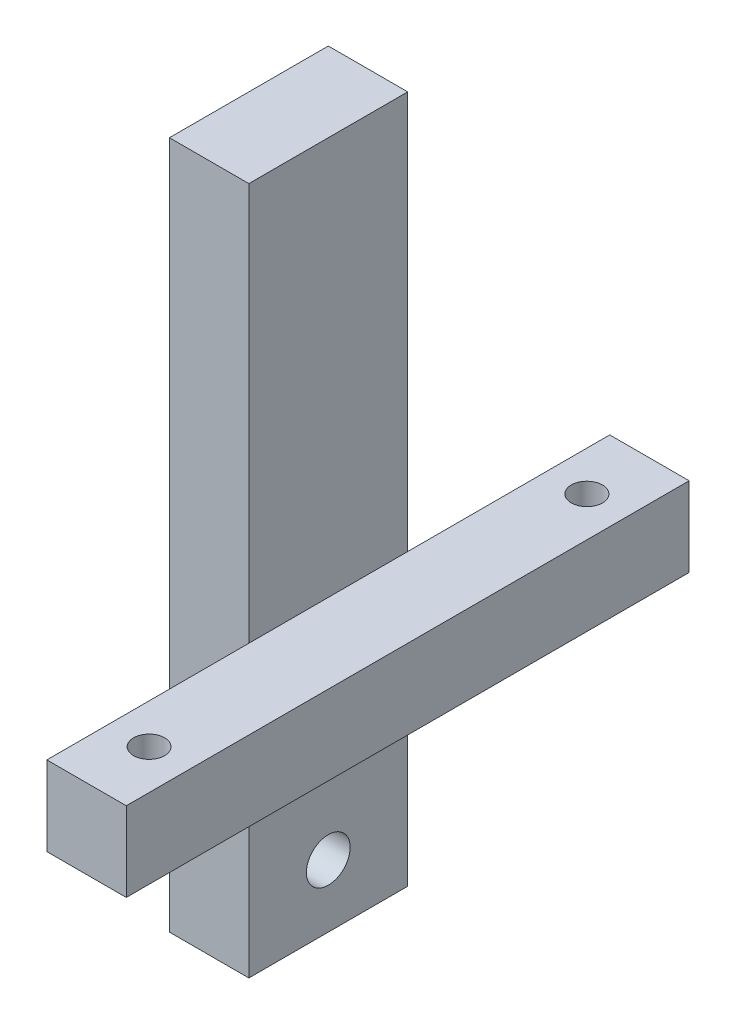
ISO-10303-21;
HEADER;
FILE_DESCRIPTION(('STEP AP214'),'2;1');
FILE_NAME('part.step','',(''),(''),'','','');
FILE_SCHEMA(('AUTOMOTIVE_DESIGN { 1 0 10303 214 1 1 1 1 }'));
ENDSEC;
DATA;
#1=APPLICATION_CONTEXT('core data for automotive mechanical design processes');
#2=APPLICATION_PROTOCOL_DEFINITION('international standard','automotive_design',2000,#1);
#3=PRODUCT_CONTEXT('',#1,'mechanical');
#4=PRODUCT('Part','Part','',(#3));
#5=PRODUCT_RELATED_PRODUCT_CATEGORY('part','',(#4));
#6=PRODUCT_DEFINITION_FORMATION('','',#4);
#7=PRODUCT_DEFINITION_CONTEXT('part definition',#1,'design');
#8=PRODUCT_DEFINITION('design','',#6,#7);
#9=PRODUCT_DEFINITION_SHAPE('','',#8);
#10=(LENGTH_UNIT() NAMED_UNIT(*) SI_UNIT(.MILLI.,.METRE.));
#11=(NAMED_UNIT(*) PLANE_ANGLE_UNIT() SI_UNIT($,.RADIAN.));
#12=(NAMED_UNIT(*) SI_UNIT($,.STERADIAN.) SOLID_ANGLE_UNIT());
#13=UNCERTAINTY_MEASURE_WITH_UNIT(LENGTH_MEASURE(1.E-05),#10,'distance_accuracy_value','');
#14=(GEOMETRIC_REPRESENTATION_CONTEXT(3) GLOBAL_UNCERTAINTY_ASSIGNED_CONTEXT((#13)) GLOBAL_UNIT_ASSIGNED_CONTEXT((#10,
#11,#12)) REPRESENTATION_CONTEXT('',''));
#15=CARTESIAN_POINT('',(0.,0.,0.));
#16=DIRECTION('',(0.,0.,1.));
#17=DIRECTION('',(1.,0.,0.));
#18=AXIS2_PLACEMENT_3D('',#15,#16,#17);
#19=CARTESIAN_POINT('',(6.35,110.,12.7));
#20=DIRECTION('',(-1.,0.,0.));
#21=DIRECTION('',(0.,0.,1.));
#22=AXIS2_PLACEMENT_3D('',#19,#20,#21);
#23=PLANE('',#22);
#24=CARTESIAN_POINT('',(6.35,10.,0.));
#25=DIRECTION('',(1.,0.,0.));
#26=DIRECTION('',(0.,0.,-1.));
#27=AXIS2_PLACEMENT_3D('',#24,#25,#26);
#28=CIRCLE('',#27,3.5);
#29=CARTESIAN_POINT('',(6.35,10.,-3.5));
#30=VERTEX_POINT('',#29);
#31=EDGE_CURVE('E175',#30,#30,#28,.T.);
#32=ORIENTED_EDGE('',*,*,#31,.F.);
#33=EDGE_LOOP('',(#32));
#34=FACE_BOUND('',#33,.T.);
#35=DIRECTION('',(0.,0.,-1.));
#36=VECTOR('',#35,1.);
#37=CARTESIAN_POINT('',(6.35,33.65,45.));
#38=LINE('',#37,#36);
#39=CARTESIAN_POINT('',(6.35,33.65,12.7));
#40=VERTEX_POINT('',#39);
#41=CARTESIAN_POINT('',(6.35,33.65,-12.7));
#42=VERTEX_POINT('',#41);
#43=EDGE_CURVE('E11',#40,#42,#38,.T.);
#44=ORIENTED_EDGE('',*,*,#43,.F.);
#45=DIRECTION('',(0.,-1.,0.));
#46=VECTOR('',#45,1.);
#47=CARTESIAN_POINT('',(6.35,110.,12.7));
#48=LINE('',#47,#46);
#49=CARTESIAN_POINT('',(6.35,0.,12.7));
#50=VERTEX_POINT('',#49);
#51=EDGE_CURVE('E166',#40,#50,#48,.T.);
#52=ORIENTED_EDGE('',*,*,#51,.T.);
#53=DIRECTION('',(0.,0.,-1.));
#54=VECTOR('',#53,1.);
#55=CARTESIAN_POINT('',(6.35,0.,12.7));
#56=LINE('',#55,#54);
#57=CARTESIAN_POINT('',(6.35,0.,-12.7));
#58=VERTEX_POINT('',#57);
#59=EDGE_CURVE('E158',#50,#58,#56,.T.);
#60=ORIENTED_EDGE('',*,*,#59,.T.);
#61=DIRECTION('',(0.,-1.,0.));
#62=VECTOR('',#61,1.);
#63=CARTESIAN_POINT('',(6.35,110.,-12.7));
#64=LINE('',#63,#62);
#65=EDGE_CURVE('E55',#42,#58,#64,.T.);
#66=ORIENTED_EDGE('',*,*,#65,.F.);
#67=EDGE_LOOP('',(#44,#52,#60,#66));
#68=FACE_BOUND('',#67,.T.);
#69=ADVANCED_FACE('F33',(#34,#68),#23,.F.);
#70=DIRECTION('',(0.,0.,1.));
#71=VECTOR('',#70,1.);
#72=CARTESIAN_POINT('',(6.35,46.35,45.));
#73=LINE('',#72,#71);
#74=CARTESIAN_POINT('',(6.35,46.35,-12.7));
#75=VERTEX_POINT('',#74);
#76=CARTESIAN_POINT('',(6.35,46.35,12.7));
#77=VERTEX_POINT('',#76);
#78=EDGE_CURVE('E42',#75,#77,#73,.T.);
#79=ORIENTED_EDGE('',*,*,#78,.F.);
#80=CARTESIAN_POINT('',(6.35,110.,-12.7));
#81=VERTEX_POINT('',#80);
#82=EDGE_CURVE('E163',#81,#75,#64,.T.);
#83=ORIENTED_EDGE('',*,*,#82,.F.);
#84=DIRECTION('',(0.,0.,-1.));
#85=VECTOR('',#84,1.);
#86=CARTESIAN_POINT('',(6.35,110.,12.7));
#87=LINE('',#86,#85);
#88=CARTESIAN_POINT('',(6.35,110.,12.7));
#89=VERTEX_POINT('',#88);
#90=EDGE_CURVE('E151',#89,#81,#87,.T.);
#91=ORIENTED_EDGE('',*,*,#90,.F.);
#92=EDGE_CURVE('E168',#89,#77,#48,.T.);
#93=ORIENTED_EDGE('',*,*,#92,.T.);
#94=EDGE_LOOP('',(#79,#83,#91,#93));
#95=FACE_BOUND('',#94,.T.);
#96=ADVANCED_FACE('F239',(#95),#23,.F.);
#97=CARTESIAN_POINT('',(-6.35,110.,12.7));
#98=DIRECTION('',(1.,0.,0.));
#99=DIRECTION('',(0.,0.,-1.));
#100=AXIS2_PLACEMENT_3D('',#97,#98,#99);
#101=PLANE('',#100);
#102=CARTESIAN_POINT('',(-6.35,10.,0.));
#103=DIRECTION('',(1.,0.,0.));
#104=DIRECTION('',(0.,0.,-1.));
#105=AXIS2_PLACEMENT_3D('',#102,#103,#104);
#106=CIRCLE('',#105,3.5);
#107=CARTESIAN_POINT('',(-6.35,10.,-3.5));
#108=VERTEX_POINT('',#107);
#109=EDGE_CURVE('E180',#108,#108,#106,.T.);
#110=ORIENTED_EDGE('',*,*,#109,.T.);
#111=EDGE_LOOP('',(#110));
#112=FACE_BOUND('',#111,.T.);
#113=DIRECTION('',(0.,0.,1.));
#114=VECTOR('',#113,1.);
#115=CARTESIAN_POINT('',(-6.35,0.,12.7));
#116=LINE('',#115,#114);
#117=CARTESIAN_POINT('',(-6.35,0.,-12.7));
#118=VERTEX_POINT('',#117);
#119=CARTESIAN_POINT('',(-6.35,0.,12.7));
#120=VERTEX_POINT('',#119);
#121=EDGE_CURVE('E136',#118,#120,#116,.T.);
#122=ORIENTED_EDGE('',*,*,#121,.T.);
#123=DIRECTION('',(0.,-1.,0.));
#124=VECTOR('',#123,1.);
#125=CARTESIAN_POINT('',(-6.35,110.,12.7));
#126=LINE('',#125,#124);
#127=CARTESIAN_POINT('',(-6.35,110.,12.7));
#128=VERTEX_POINT('',#127);
#129=EDGE_CURVE('E170',#128,#120,#126,.T.);
#130=ORIENTED_EDGE('',*,*,#129,.F.);
#131=DIRECTION('',(0.,0.,1.));
#132=VECTOR('',#131,1.);
#133=CARTESIAN_POINT('',(-6.35,110.,12.7));
#134=LINE('',#133,#132);
#135=CARTESIAN_POINT('',(-6.35,110.,-12.7));
#136=VERTEX_POINT('',#135);
#137=EDGE_CURVE('E145',#136,#128,#134,.T.);
#138=ORIENTED_EDGE('',*,*,#137,.F.);
#139=DIRECTION('',(0.,-1.,0.));
#140=VECTOR('',#139,1.);
#141=CARTESIAN_POINT('',(-6.35,110.,-12.7));
#142=LINE('',#141,#140);
#143=EDGE_CURVE('E154',#136,#118,#142,.T.);
#144=ORIENTED_EDGE('',*,*,#143,.T.);
#145=EDGE_LOOP('',(#122,#130,#138,#144));
#146=FACE_BOUND('',#145,.T.);
#147=ADVANCED_FACE('F35',(#112,#146),#101,.F.);
#148=CARTESIAN_POINT('',(6.35,110.,12.7));
#149=DIRECTION('',(0.,0.,-1.));
#150=DIRECTION('',(-1.,0.,0.));
#151=AXIS2_PLACEMENT_3D('',#148,#149,#150);
#152=PLANE('',#151);
#153=DIRECTION('',(1.,0.,0.));
#154=VECTOR('',#153,1.);
#155=CARTESIAN_POINT('',(6.35,0.,12.7));
#156=LINE('',#155,#154);
#157=EDGE_CURVE('E139',#120,#50,#156,.T.);
#158=ORIENTED_EDGE('',*,*,#157,.T.);
#159=ORIENTED_EDGE('',*,*,#51,.F.);
#160=EDGE_CURVE('E171',#77,#40,#48,.T.);
#161=ORIENTED_EDGE('',*,*,#160,.F.);
#162=ORIENTED_EDGE('',*,*,#92,.F.);
#163=DIRECTION('',(1.,0.,0.));
#164=VECTOR('',#163,1.);
#165=CARTESIAN_POINT('',(6.35,110.,12.7));
#166=LINE('',#165,#164);
#167=EDGE_CURVE('E148',#128,#89,#166,.T.);
#168=ORIENTED_EDGE('',*,*,#167,.F.);
#169=ORIENTED_EDGE('',*,*,#129,.T.);
#170=EDGE_LOOP('',(#158,#159,#161,#162,#168,#169));
#171=FACE_BOUND('',#170,.T.);
#172=ADVANCED_FACE('F219',(#171),#152,.F.);
#173=CARTESIAN_POINT('',(6.35,110.,-12.7));
#174=DIRECTION('',(0.,0.,1.));
#175=DIRECTION('',(1.,0.,0.));
#176=AXIS2_PLACEMENT_3D('',#173,#174,#175);
#177=PLANE('',#176);
#178=DIRECTION('',(-1.,0.,0.));
#179=VECTOR('',#178,1.);
#180=CARTESIAN_POINT('',(6.35,0.,-12.7));
#181=LINE('',#180,#179);
#182=EDGE_CURVE('E149',#58,#118,#181,.T.);
#183=ORIENTED_EDGE('',*,*,#182,.T.);
#184=ORIENTED_EDGE('',*,*,#143,.F.);
#185=DIRECTION('',(-1.,0.,0.));
#186=VECTOR('',#185,1.);
#187=CARTESIAN_POINT('',(6.35,110.,-12.7));
#188=LINE('',#187,#186);
#189=EDGE_CURVE('E153',#81,#136,#188,.T.);
#190=ORIENTED_EDGE('',*,*,#189,.F.);
#191=ORIENTED_EDGE('',*,*,#82,.T.);
#192=EDGE_CURVE('E167',#75,#42,#64,.T.);
#193=ORIENTED_EDGE('',*,*,#192,.T.);
#194=ORIENTED_EDGE('',*,*,#65,.T.);
#195=EDGE_LOOP('',(#183,#184,#190,#191,#193,#194));
#196=FACE_BOUND('',#195,.T.);
#197=ADVANCED_FACE('F226',(#196),#177,.F.);
#198=CARTESIAN_POINT('',(0.,110.,0.));
#199=DIRECTION('',(0.,1.,0.));
#200=DIRECTION('',(0.,0.,1.));
#201=AXIS2_PLACEMENT_3D('',#198,#199,#200);
#202=PLANE('',#201);
#203=ORIENTED_EDGE('',*,*,#137,.T.);
#204=ORIENTED_EDGE('',*,*,#167,.T.);
#205=ORIENTED_EDGE('',*,*,#90,.T.);
#206=ORIENTED_EDGE('',*,*,#189,.T.);
#207=EDGE_LOOP('',(#203,#204,#205,#206));
#208=FACE_BOUND('',#207,.T.);
#209=ADVANCED_FACE('F231',(#208),#202,.T.);
#210=CARTESIAN_POINT('',(0.,0.,0.));
#211=DIRECTION('',(0.,1.,0.));
#212=DIRECTION('',(0.,0.,1.));
#213=AXIS2_PLACEMENT_3D('',#210,#211,#212);
#214=PLANE('',#213);
#215=ORIENTED_EDGE('',*,*,#121,.F.);
#216=ORIENTED_EDGE('',*,*,#182,.F.);
#217=ORIENTED_EDGE('',*,*,#59,.F.);
#218=ORIENTED_EDGE('',*,*,#157,.F.);
#219=EDGE_LOOP('',(#215,#216,#217,#218));
#220=FACE_BOUND('',#219,.T.);
#221=ADVANCED_FACE('F223',(#220),#214,.F.);
#222=CARTESIAN_POINT('',(6.35,0.,0.));
#223=DIRECTION('',(1.,0.,0.));
#224=DIRECTION('',(0.,0.,-1.));
#225=AXIS2_PLACEMENT_3D('',#222,#223,#224);
#226=PLANE('',#225);
#227=CARTESIAN_POINT('',(6.35,46.35,45.));
#228=VERTEX_POINT('',#227);
#229=EDGE_CURVE('E196',#77,#228,#73,.T.);
#230=ORIENTED_EDGE('',*,*,#229,.F.);
#231=ORIENTED_EDGE('',*,*,#160,.T.);
#232=CARTESIAN_POINT('',(6.35,33.65,45.));
#233=VERTEX_POINT('',#232);
#234=EDGE_CURVE('E44',#233,#40,#38,.T.);
#235=ORIENTED_EDGE('',*,*,#234,.F.);
#236=DIRECTION('',(0.,-1.,0.));
#237=VECTOR('',#236,1.);
#238=CARTESIAN_POINT('',(6.35,46.35,45.));
#239=LINE('',#238,#237);
#240=EDGE_CURVE('E199',#228,#233,#239,.T.);
#241=ORIENTED_EDGE('',*,*,#240,.F.);
#242=EDGE_LOOP('',(#230,#231,#235,#241));
#243=FACE_BOUND('',#242,.T.);
#244=ADVANCED_FACE('F212',(#243),#226,.F.);
#245=CARTESIAN_POINT('',(19.05,46.35,-45.));
#246=DIRECTION('',(0.,0.,1.));
#247=DIRECTION('',(0.,-1.,0.));
#248=AXIS2_PLACEMENT_3D('',#245,#246,#247);
#249=PLANE('',#248);
#250=DIRECTION('',(0.,1.,0.));
#251=VECTOR('',#250,1.);
#252=CARTESIAN_POINT('',(6.35,46.35,-45.));
#253=LINE('',#252,#251);
#254=CARTESIAN_POINT('',(6.35,33.65,-45.));
#255=VERTEX_POINT('',#254);
#256=CARTESIAN_POINT('',(6.35,46.35,-45.));
#257=VERTEX_POINT('',#256);
#258=EDGE_CURVE('E135',#255,#257,#253,.T.);
#259=ORIENTED_EDGE('',*,*,#258,.T.);
#260=DIRECTION('',(-1.,0.,0.));
#261=VECTOR('',#260,1.);
#262=CARTESIAN_POINT('',(19.05,46.35,-45.));
#263=LINE('',#262,#261);
#264=CARTESIAN_POINT('',(19.05,46.35,-45.));
#265=VERTEX_POINT('',#264);
#266=EDGE_CURVE('E116',#265,#257,#263,.T.);
#267=ORIENTED_EDGE('',*,*,#266,.F.);
#268=DIRECTION('',(0.,1.,0.));
#269=VECTOR('',#268,1.);
#270=CARTESIAN_POINT('',(19.05,46.35,-45.));
#271=LINE('',#270,#269);
#272=CARTESIAN_POINT('',(19.05,33.65,-45.));
#273=VERTEX_POINT('',#272);
#274=EDGE_CURVE('E123',#273,#265,#271,.T.);
#275=ORIENTED_EDGE('',*,*,#274,.F.);
#276=DIRECTION('',(-1.,0.,0.));
#277=VECTOR('',#276,1.);
#278=CARTESIAN_POINT('',(19.05,33.65,-45.));
#279=LINE('',#278,#277);
#280=EDGE_CURVE('E194',#273,#255,#279,.T.);
#281=ORIENTED_EDGE('',*,*,#280,.T.);
#282=EDGE_LOOP('',(#259,#267,#275,#281));
#283=FACE_BOUND('',#282,.T.);
#284=ADVANCED_FACE('F133',(#283),#249,.F.);
#285=CARTESIAN_POINT('',(19.05,46.35,45.));
#286=DIRECTION('',(0.,-1.,0.));
#287=DIRECTION('',(0.,0.,-1.));
#288=AXIS2_PLACEMENT_3D('',#285,#286,#287);
#289=PLANE('',#288);
#290=CARTESIAN_POINT('',(12.7,46.35,35.));
#291=DIRECTION('',(0.,1.,0.));
#292=DIRECTION('',(0.,0.,1.));
#293=AXIS2_PLACEMENT_3D('',#290,#291,#292);
#294=CIRCLE('',#293,2.48227602519867);
#295=CARTESIAN_POINT('',(12.7,46.35,37.4822760251987));
#296=VERTEX_POINT('',#295);
#297=EDGE_CURVE('E187',#296,#296,#294,.T.);
#298=ORIENTED_EDGE('',*,*,#297,.F.);
#299=EDGE_LOOP('',(#298));
#300=FACE_BOUND('',#299,.T.);
#301=CARTESIAN_POINT('',(12.7,46.35,-35.));
#302=DIRECTION('',(0.,1.,0.));
#303=DIRECTION('',(0.,0.,1.));
#304=AXIS2_PLACEMENT_3D('',#301,#302,#303);
#305=CIRCLE('',#304,2.49485373628584);
#306=CARTESIAN_POINT('',(12.7,46.35,-32.5051462637142));
#307=VERTEX_POINT('',#306);
#308=EDGE_CURVE('E176',#307,#307,#305,.T.);
#309=ORIENTED_EDGE('',*,*,#308,.F.);
#310=EDGE_LOOP('',(#309));
#311=FACE_BOUND('',#310,.T.);
#312=EDGE_CURVE('E197',#257,#75,#73,.T.);
#313=ORIENTED_EDGE('',*,*,#312,.T.);
#314=ORIENTED_EDGE('',*,*,#78,.T.);
#315=ORIENTED_EDGE('',*,*,#229,.T.);
#316=DIRECTION('',(-1.,0.,0.));
#317=VECTOR('',#316,1.);
#318=CARTESIAN_POINT('',(19.05,46.35,45.));
#319=LINE('',#318,#317);
#320=CARTESIAN_POINT('',(19.05,46.35,45.));
#321=VERTEX_POINT('',#320);
#322=EDGE_CURVE('E119',#321,#228,#319,.T.);
#323=ORIENTED_EDGE('',*,*,#322,.F.);
#324=DIRECTION('',(0.,0.,1.));
#325=VECTOR('',#324,1.);
#326=CARTESIAN_POINT('',(19.05,46.35,45.));
#327=LINE('',#326,#325);
#328=EDGE_CURVE('E111',#265,#321,#327,.T.);
#329=ORIENTED_EDGE('',*,*,#328,.F.);
#330=ORIENTED_EDGE('',*,*,#266,.T.);
#331=EDGE_LOOP('',(#313,#314,#315,#323,#329,#330));
#332=FACE_BOUND('',#331,.T.);
#333=ADVANCED_FACE('F114',(#300,#311,#332),#289,.F.);
#334=CARTESIAN_POINT('',(19.05,46.35,45.));
#335=DIRECTION('',(0.,0.,-1.));
#336=DIRECTION('',(0.,1.,0.));
#337=AXIS2_PLACEMENT_3D('',#334,#335,#336);
#338=PLANE('',#337);
#339=ORIENTED_EDGE('',*,*,#240,.T.);
#340=DIRECTION('',(-1.,0.,0.));
#341=VECTOR('',#340,1.);
#342=CARTESIAN_POINT('',(19.05,33.65,45.));
#343=LINE('',#342,#341);
#344=CARTESIAN_POINT('',(19.05,33.65,45.));
#345=VERTEX_POINT('',#344);
#346=EDGE_CURVE('E141',#345,#233,#343,.T.);
#347=ORIENTED_EDGE('',*,*,#346,.F.);
#348=DIRECTION('',(0.,-1.,0.));
#349=VECTOR('',#348,1.);
#350=CARTESIAN_POINT('',(19.05,46.35,45.));
#351=LINE('',#350,#349);
#352=EDGE_CURVE('E122',#321,#345,#351,.T.);
#353=ORIENTED_EDGE('',*,*,#352,.F.);
#354=ORIENTED_EDGE('',*,*,#322,.T.);
#355=EDGE_LOOP('',(#339,#347,#353,#354));
#356=FACE_BOUND('',#355,.T.);
#357=ADVANCED_FACE('F266',(#356),#338,.F.);
#358=CARTESIAN_POINT('',(19.05,33.65,45.));
#359=DIRECTION('',(0.,1.,0.));
#360=DIRECTION('',(0.,0.,1.));
#361=AXIS2_PLACEMENT_3D('',#358,#359,#360);
#362=PLANE('',#361);
#363=CARTESIAN_POINT('',(12.7,33.65,35.));
#364=DIRECTION('',(0.,1.,0.));
#365=DIRECTION('',(0.,0.,1.));
#366=AXIS2_PLACEMENT_3D('',#363,#364,#365);
#367=CIRCLE('',#366,2.48227602519867);
#368=CARTESIAN_POINT('',(12.7,33.65,37.4822760251987));
#369=VERTEX_POINT('',#368);
#370=EDGE_CURVE('E37',#369,#369,#367,.T.);
#371=ORIENTED_EDGE('',*,*,#370,.T.);
#372=EDGE_LOOP('',(#371));
#373=FACE_BOUND('',#372,.T.);
#374=CARTESIAN_POINT('',(12.7,33.65,-35.));
#375=DIRECTION('',(0.,1.,0.));
#376=DIRECTION('',(0.,0.,1.));
#377=AXIS2_PLACEMENT_3D('',#374,#375,#376);
#378=CIRCLE('',#377,2.49485373628584);
#379=CARTESIAN_POINT('',(12.7,33.65,-32.5051462637142));
#380=VERTEX_POINT('',#379);
#381=EDGE_CURVE('E173',#380,#380,#378,.T.);
#382=ORIENTED_EDGE('',*,*,#381,.T.);
#383=EDGE_LOOP('',(#382));
#384=FACE_BOUND('',#383,.T.);
#385=ORIENTED_EDGE('',*,*,#234,.T.);
#386=ORIENTED_EDGE('',*,*,#43,.T.);
#387=EDGE_CURVE('E45',#42,#255,#38,.T.);
#388=ORIENTED_EDGE('',*,*,#387,.T.);
#389=ORIENTED_EDGE('',*,*,#280,.F.);
#390=DIRECTION('',(0.,0.,-1.));
#391=VECTOR('',#390,1.);
#392=CARTESIAN_POINT('',(19.05,33.65,45.));
#393=LINE('',#392,#391);
#394=EDGE_CURVE('E128',#345,#273,#393,.T.);
#395=ORIENTED_EDGE('',*,*,#394,.F.);
#396=ORIENTED_EDGE('',*,*,#346,.T.);
#397=EDGE_LOOP('',(#385,#386,#388,#389,#395,#396));
#398=FACE_BOUND('',#397,.T.);
#399=ADVANCED_FACE('F206',(#373,#384,#398),#362,.F.);
#400=CARTESIAN_POINT('',(19.05,0.,0.));
#401=DIRECTION('',(1.,0.,0.));
#402=DIRECTION('',(0.,0.,-1.));
#403=AXIS2_PLACEMENT_3D('',#400,#401,#402);
#404=PLANE('',#403);
#405=ORIENTED_EDGE('',*,*,#274,.T.);
#406=ORIENTED_EDGE('',*,*,#328,.T.);
#407=ORIENTED_EDGE('',*,*,#352,.T.);
#408=ORIENTED_EDGE('',*,*,#394,.T.);
#409=EDGE_LOOP('',(#405,#406,#407,#408));
#410=FACE_BOUND('',#409,.T.);
#411=ADVANCED_FACE('F126',(#410),#404,.T.);
#412=ORIENTED_EDGE('',*,*,#192,.F.);
#413=ORIENTED_EDGE('',*,*,#312,.F.);
#414=ORIENTED_EDGE('',*,*,#258,.F.);
#415=ORIENTED_EDGE('',*,*,#387,.F.);
#416=EDGE_LOOP('',(#412,#413,#414,#415));
#417=FACE_BOUND('',#416,.T.);
#418=ADVANCED_FACE('F238',(#417),#226,.F.);
#419=CARTESIAN_POINT('',(-6.35,10.,0.));
#420=DIRECTION('',(1.,0.,0.));
#421=DIRECTION('',(0.,0.,-1.));
#422=AXIS2_PLACEMENT_3D('',#419,#420,#421);
#423=CYLINDRICAL_SURFACE('',#422,3.5);
#424=ORIENTED_EDGE('',*,*,#109,.F.);
#425=EDGE_LOOP('',(#424));
#426=FACE_BOUND('',#425,.T.);
#427=ORIENTED_EDGE('',*,*,#31,.T.);
#428=EDGE_LOOP('',(#427));
#429=FACE_BOUND('',#428,.T.);
#430=ADVANCED_FACE('F275',(#426,#429),#423,.F.);
#431=CARTESIAN_POINT('',(12.7,0.,-35.));
#432=DIRECTION('',(0.,1.,0.));
#433=DIRECTION('',(0.,0.,1.));
#434=AXIS2_PLACEMENT_3D('',#431,#432,#433);
#435=CYLINDRICAL_SURFACE('',#434,2.49485373628584);
#436=ORIENTED_EDGE('',*,*,#308,.T.);
#437=EDGE_LOOP('',(#436));
#438=FACE_BOUND('',#437,.T.);
#439=ORIENTED_EDGE('',*,*,#381,.F.);
#440=EDGE_LOOP('',(#439));
#441=FACE_BOUND('',#440,.T.);
#442=ADVANCED_FACE('F280',(#438,#441),#435,.F.);
#443=CARTESIAN_POINT('',(12.7,0.,35.));
#444=DIRECTION('',(0.,1.,0.));
#445=DIRECTION('',(0.,0.,1.));
#446=AXIS2_PLACEMENT_3D('',#443,#444,#445);
#447=CYLINDRICAL_SURFACE('',#446,2.48227602519867);
#448=ORIENTED_EDGE('',*,*,#297,.T.);
#449=EDGE_LOOP('',(#448));
#450=FACE_BOUND('',#449,.T.);
#451=ORIENTED_EDGE('',*,*,#370,.F.);
#452=EDGE_LOOP('',(#451));
#453=FACE_BOUND('',#452,.T.);
#454=ADVANCED_FACE('F284',(#450,#453),#447,.F.);
#455=CLOSED_SHELL('',(#69,#96,#147,#172,#197,#209,#221,#244,#284,#333,#357,#399,#411,#418,#430,
#442,#454));
#456=MANIFOLD_SOLID_BREP('B2',#455);
#457=ADVANCED_BREP_SHAPE_REPRESENTATION('',(#18,#456),#14);
#458=SHAPE_DEFINITION_REPRESENTATION(#9,#457);
ENDSEC;
END-ISO-10303-21;
